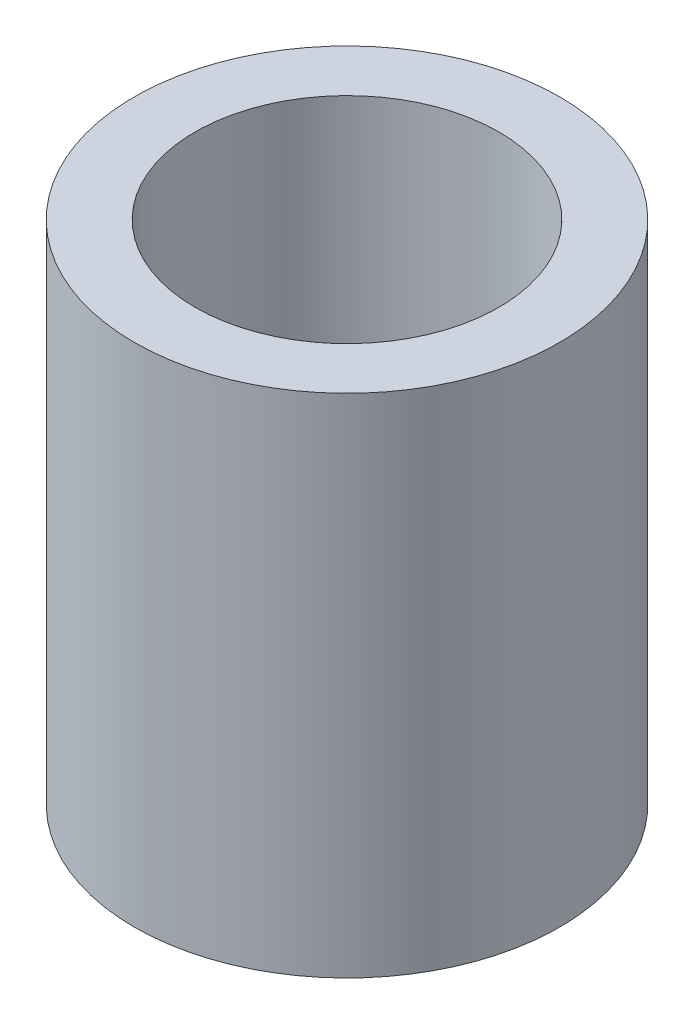
ISO-10303-21;
HEADER;
FILE_DESCRIPTION(('STEP AP214'),'2;1');
FILE_NAME('part.step','',(''),(''),'','','');
FILE_SCHEMA(('AUTOMOTIVE_DESIGN { 1 0 10303 214 1 1 1 1 }'));
ENDSEC;
DATA;
#1=APPLICATION_CONTEXT('core data for automotive mechanical design processes');
#2=APPLICATION_PROTOCOL_DEFINITION('international standard','automotive_design',2000,#1);
#3=PRODUCT_CONTEXT('',#1,'mechanical');
#4=PRODUCT('Part','Part','',(#3));
#5=PRODUCT_RELATED_PRODUCT_CATEGORY('part','',(#4));
#6=PRODUCT_DEFINITION_FORMATION('','',#4);
#7=PRODUCT_DEFINITION_CONTEXT('part definition',#1,'design');
#8=PRODUCT_DEFINITION('design','',#6,#7);
#9=PRODUCT_DEFINITION_SHAPE('','',#8);
#10=(LENGTH_UNIT() NAMED_UNIT(*) SI_UNIT(.MILLI.,.METRE.));
#11=(NAMED_UNIT(*) PLANE_ANGLE_UNIT() SI_UNIT($,.RADIAN.));
#12=(NAMED_UNIT(*) SI_UNIT($,.STERADIAN.) SOLID_ANGLE_UNIT());
#13=UNCERTAINTY_MEASURE_WITH_UNIT(LENGTH_MEASURE(1.E-05),#10,'distance_accuracy_value','');
#14=(GEOMETRIC_REPRESENTATION_CONTEXT(3) GLOBAL_UNCERTAINTY_ASSIGNED_CONTEXT((#13)) GLOBAL_UNIT_ASSIGNED_CONTEXT((#10,
#11,#12)) REPRESENTATION_CONTEXT('',''));
#15=CARTESIAN_POINT('',(0.,0.,0.));
#16=DIRECTION('',(0.,0.,1.));
#17=DIRECTION('',(1.,0.,0.));
#18=AXIS2_PLACEMENT_3D('',#15,#16,#17);
#19=CARTESIAN_POINT('',(0.,5.,0.));
#20=DIRECTION('',(0.,1.,0.));
#21=DIRECTION('',(0.,0.,1.));
#22=AXIS2_PLACEMENT_3D('',#19,#20,#21);
#23=PLANE('',#22);
#24=CARTESIAN_POINT('',(0.,5.,0.));
#25=DIRECTION('',(0.,1.,0.));
#26=DIRECTION('',(0.,0.,1.));
#27=AXIS2_PLACEMENT_3D('',#24,#25,#26);
#28=CIRCLE('',#27,2.1);
#29=CARTESIAN_POINT('',(0.,5.,2.1));
#30=VERTEX_POINT('',#29);
#31=EDGE_CURVE('E10',#30,#30,#28,.T.);
#32=ORIENTED_EDGE('',*,*,#31,.T.);
#33=EDGE_LOOP('',(#32));
#34=FACE_BOUND('',#33,.T.);
#35=CARTESIAN_POINT('',(0.,5.,0.));
#36=DIRECTION('',(0.,1.,0.));
#37=DIRECTION('',(0.,0.,1.));
#38=AXIS2_PLACEMENT_3D('',#35,#36,#37);
#39=CIRCLE('',#38,1.5);
#40=CARTESIAN_POINT('',(0.,5.,1.5));
#41=VERTEX_POINT('',#40);
#42=EDGE_CURVE('E43',#41,#41,#39,.T.);
#43=ORIENTED_EDGE('',*,*,#42,.F.);
#44=EDGE_LOOP('',(#43));
#45=FACE_BOUND('',#44,.T.);
#46=ADVANCED_FACE('F32',(#34,#45),#23,.T.);
#47=CARTESIAN_POINT('',(0.,0.,0.));
#48=DIRECTION('',(0.,1.,0.));
#49=DIRECTION('',(0.,0.,1.));
#50=AXIS2_PLACEMENT_3D('',#47,#48,#49);
#51=PLANE('',#50);
#52=CARTESIAN_POINT('',(0.,0.,0.));
#53=DIRECTION('',(0.,1.,0.));
#54=DIRECTION('',(0.,0.,1.));
#55=AXIS2_PLACEMENT_3D('',#52,#53,#54);
#56=CIRCLE('',#55,2.1);
#57=CARTESIAN_POINT('',(0.,0.,2.1));
#58=VERTEX_POINT('',#57);
#59=EDGE_CURVE('E36',#58,#58,#56,.T.);
#60=ORIENTED_EDGE('',*,*,#59,.F.);
#61=EDGE_LOOP('',(#60));
#62=FACE_BOUND('',#61,.T.);
#63=CARTESIAN_POINT('',(0.,0.,0.));
#64=DIRECTION('',(0.,1.,0.));
#65=DIRECTION('',(0.,0.,1.));
#66=AXIS2_PLACEMENT_3D('',#63,#64,#65);
#67=CIRCLE('',#66,1.5);
#68=CARTESIAN_POINT('',(0.,0.,1.5));
#69=VERTEX_POINT('',#68);
#70=EDGE_CURVE('E45',#69,#69,#67,.T.);
#71=ORIENTED_EDGE('',*,*,#70,.T.);
#72=EDGE_LOOP('',(#71));
#73=FACE_BOUND('',#72,.T.);
#74=ADVANCED_FACE('F55',(#62,#73),#51,.F.);
#75=CARTESIAN_POINT('',(0.,5.,0.));
#76=DIRECTION('',(0.,-1.,0.));
#77=DIRECTION('',(0.,0.,-1.));
#78=AXIS2_PLACEMENT_3D('',#75,#76,#77);
#79=CYLINDRICAL_SURFACE('',#78,2.1);
#80=ORIENTED_EDGE('',*,*,#31,.F.);
#81=EDGE_LOOP('',(#80));
#82=FACE_BOUND('',#81,.T.);
#83=ORIENTED_EDGE('',*,*,#59,.T.);
#84=EDGE_LOOP('',(#83));
#85=FACE_BOUND('',#84,.T.);
#86=ADVANCED_FACE('F34',(#82,#85),#79,.T.);
#87=CARTESIAN_POINT('',(0.,5.,0.));
#88=DIRECTION('',(0.,-1.,0.));
#89=DIRECTION('',(0.,0.,-1.));
#90=AXIS2_PLACEMENT_3D('',#87,#88,#89);
#91=CYLINDRICAL_SURFACE('',#90,1.5);
#92=ORIENTED_EDGE('',*,*,#42,.T.);
#93=EDGE_LOOP('',(#92));
#94=FACE_BOUND('',#93,.T.);
#95=ORIENTED_EDGE('',*,*,#70,.F.);
#96=EDGE_LOOP('',(#95));
#97=FACE_BOUND('',#96,.T.);
#98=ADVANCED_FACE('F51',(#94,#97),#91,.F.);
#99=CLOSED_SHELL('',(#46,#74,#86,#98));
#100=MANIFOLD_SOLID_BREP('B2',#99);
#101=ADVANCED_BREP_SHAPE_REPRESENTATION('',(#18,#100),#14);
#102=SHAPE_DEFINITION_REPRESENTATION(#9,#101);
ENDSEC;
END-ISO-10303-21;
